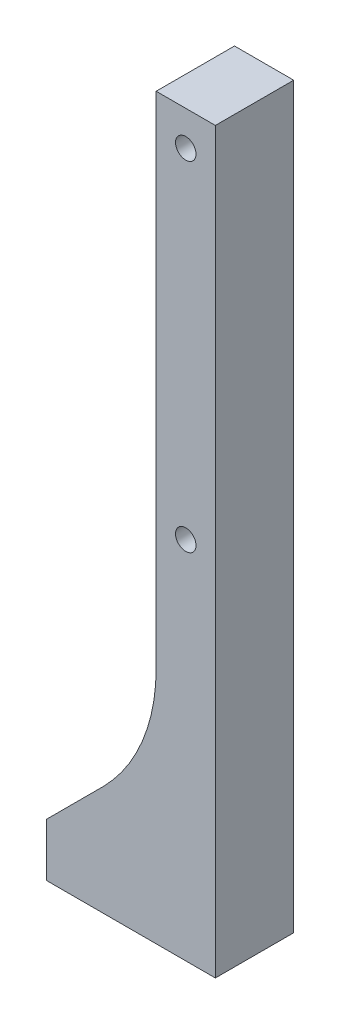
ISO-10303-21;
HEADER;
FILE_DESCRIPTION(('STEP AP214'),'2;1');
FILE_NAME('part.step','',(''),(''),'','','');
FILE_SCHEMA(('AUTOMOTIVE_DESIGN { 1 0 10303 214 1 1 1 1 }'));
ENDSEC;
DATA;
#1=APPLICATION_CONTEXT('core data for automotive mechanical design processes');
#2=APPLICATION_PROTOCOL_DEFINITION('international standard','automotive_design',2000,#1);
#3=PRODUCT_CONTEXT('',#1,'mechanical');
#4=PRODUCT('Part','Part','',(#3));
#5=PRODUCT_RELATED_PRODUCT_CATEGORY('part','',(#4));
#6=PRODUCT_DEFINITION_FORMATION('','',#4);
#7=PRODUCT_DEFINITION_CONTEXT('part definition',#1,'design');
#8=PRODUCT_DEFINITION('design','',#6,#7);
#9=PRODUCT_DEFINITION_SHAPE('','',#8);
#10=(LENGTH_UNIT() NAMED_UNIT(*) SI_UNIT(.MILLI.,.METRE.));
#11=(NAMED_UNIT(*) PLANE_ANGLE_UNIT() SI_UNIT($,.RADIAN.));
#12=(NAMED_UNIT(*) SI_UNIT($,.STERADIAN.) SOLID_ANGLE_UNIT());
#13=UNCERTAINTY_MEASURE_WITH_UNIT(LENGTH_MEASURE(1.E-05),#10,'distance_accuracy_value','');
#14=(GEOMETRIC_REPRESENTATION_CONTEXT(3) GLOBAL_UNCERTAINTY_ASSIGNED_CONTEXT((#13)) GLOBAL_UNIT_ASSIGNED_CONTEXT((#10,
#11,#12)) REPRESENTATION_CONTEXT('',''));
#15=CARTESIAN_POINT('',(0.,0.,0.));
#16=DIRECTION('',(0.,0.,1.));
#17=DIRECTION('',(1.,0.,0.));
#18=AXIS2_PLACEMENT_3D('',#15,#16,#17);
#19=CARTESIAN_POINT('',(3.25,5.8,3.25));
#20=DIRECTION('',(-1.,0.,0.));
#21=DIRECTION('',(0.,0.,1.));
#22=AXIS2_PLACEMENT_3D('',#19,#20,#21);
#23=PLANE('',#22);
#24=DIRECTION('',(0.,0.,-1.));
#25=VECTOR('',#24,1.);
#26=CARTESIAN_POINT('',(3.25,5.8,3.25));
#27=LINE('',#26,#25);
#28=CARTESIAN_POINT('',(3.25,5.8,3.5));
#29=VERTEX_POINT('',#28);
#30=CARTESIAN_POINT('',(3.25,5.8,-3.25));
#31=VERTEX_POINT('',#30);
#32=EDGE_CURVE('E195',#29,#31,#27,.T.);
#33=ORIENTED_EDGE('',*,*,#32,.F.);
#34=DIRECTION('',(0.,-1.,0.));
#35=VECTOR('',#34,1.);
#36=CARTESIAN_POINT('',(3.25,81.05,3.5));
#37=LINE('',#36,#35);
#38=CARTESIAN_POINT('',(3.25,0.,3.5));
#39=VERTEX_POINT('',#38);
#40=EDGE_CURVE('E201',#29,#39,#37,.T.);
#41=ORIENTED_EDGE('',*,*,#40,.T.);
#42=DIRECTION('',(0.,0.,-1.));
#43=VECTOR('',#42,1.);
#44=CARTESIAN_POINT('',(3.25,0.,3.25));
#45=LINE('',#44,#43);
#46=CARTESIAN_POINT('',(3.25,0.,-3.25));
#47=VERTEX_POINT('',#46);
#48=EDGE_CURVE('E249',#39,#47,#45,.T.);
#49=ORIENTED_EDGE('',*,*,#48,.T.);
#50=DIRECTION('',(0.,-1.,0.));
#51=VECTOR('',#50,1.);
#52=CARTESIAN_POINT('',(3.25,5.8,-3.25));
#53=LINE('',#52,#51);
#54=EDGE_CURVE('E252',#31,#47,#53,.T.);
#55=ORIENTED_EDGE('',*,*,#54,.F.);
#56=EDGE_LOOP('',(#33,#41,#49,#55));
#57=FACE_BOUND('',#56,.T.);
#58=ADVANCED_FACE('F37',(#57),#23,.F.);
#59=CARTESIAN_POINT('',(-11.19,26.1442712474619,-13.8054155622195));
#60=DIRECTION('',(0.,0.,1.));
#61=DIRECTION('',(1.,0.,0.));
#62=AXIS2_PLACEMENT_3D('',#59,#60,#61);
#63=CYLINDRICAL_SURFACE('',#62,20.);
#64=CARTESIAN_POINT('',(-11.19,26.1442712474619,3.5));
#65=DIRECTION('',(0.,0.,-1.));
#66=DIRECTION('',(-1.,0.,0.));
#67=AXIS2_PLACEMENT_3D('',#64,#65,#66);
#68=CIRCLE('',#67,20.);
#69=CARTESIAN_POINT('',(2.95213562373095,12.002135623731,3.5));
#70=VERTEX_POINT('',#69);
#71=CARTESIAN_POINT('',(8.81,26.1442712474619,3.5));
#72=VERTEX_POINT('',#71);
#73=EDGE_CURVE('E335',#70,#72,#68,.F.);
#74=ORIENTED_EDGE('',*,*,#73,.F.);
#75=DIRECTION('',(0.,0.,-1.));
#76=VECTOR('',#75,1.);
#77=CARTESIAN_POINT('',(2.95213562373095,12.002135623731,-13.8054155622195));
#78=LINE('',#77,#76);
#79=CARTESIAN_POINT('',(2.95213562373095,12.002135623731,12.1));
#80=VERTEX_POINT('',#79);
#81=EDGE_CURVE('E210',#80,#70,#78,.T.);
#82=ORIENTED_EDGE('',*,*,#81,.F.);
#83=CARTESIAN_POINT('',(-11.19,26.1442712474619,12.1));
#84=DIRECTION('',(0.,0.,1.));
#85=DIRECTION('',(1.,0.,0.));
#86=AXIS2_PLACEMENT_3D('',#83,#84,#85);
#87=CIRCLE('',#86,20.);
#88=CARTESIAN_POINT('',(8.81,26.1442712474619,12.1));
#89=VERTEX_POINT('',#88);
#90=EDGE_CURVE('E265',#80,#89,#87,.T.);
#91=ORIENTED_EDGE('',*,*,#90,.T.);
#92=DIRECTION('',(0.,0.,-1.));
#93=VECTOR('',#92,1.);
#94=CARTESIAN_POINT('',(8.81,26.1442712474619,-13.8054155622195));
#95=LINE('',#94,#93);
#96=EDGE_CURVE('E263',#72,#89,#95,.F.);
#97=ORIENTED_EDGE('',*,*,#96,.F.);
#98=EDGE_LOOP('',(#74,#82,#91,#97));
#99=FACE_BOUND('',#98,.T.);
#100=ADVANCED_FACE('F39',(#99),#63,.F.);
#101=CARTESIAN_POINT('',(0.,0.,0.));
#102=DIRECTION('',(0.,1.,0.));
#103=DIRECTION('',(0.,0.,1.));
#104=AXIS2_PLACEMENT_3D('',#101,#102,#103);
#105=PLANE('',#104);
#106=CARTESIAN_POINT('',(0.,0.,0.));
#107=DIRECTION('',(0.,1.,0.));
#108=DIRECTION('',(0.,0.,1.));
#109=AXIS2_PLACEMENT_3D('',#106,#107,#108);
#110=CIRCLE('',#109,1.5);
#111=CARTESIAN_POINT('',(0.,0.,1.5));
#112=VERTEX_POINT('',#111);
#113=EDGE_CURVE('E242',#112,#112,#110,.T.);
#114=ORIENTED_EDGE('',*,*,#113,.T.);
#115=EDGE_LOOP('',(#114));
#116=FACE_BOUND('',#115,.T.);
#117=DIRECTION('',(1.,0.,0.));
#118=VECTOR('',#117,1.);
#119=CARTESIAN_POINT('',(0.,0.,3.5));
#120=LINE('',#119,#118);
#121=CARTESIAN_POINT('',(15.31,0.,3.5));
#122=VERTEX_POINT('',#121);
#123=EDGE_CURVE('E202',#39,#122,#120,.T.);
#124=ORIENTED_EDGE('',*,*,#123,.T.);
#125=DIRECTION('',(0.,0.,-1.));
#126=VECTOR('',#125,1.);
#127=CARTESIAN_POINT('',(15.31,0.,0.));
#128=LINE('',#127,#126);
#129=CARTESIAN_POINT('',(15.31,0.,12.1));
#130=VERTEX_POINT('',#129);
#131=EDGE_CURVE('E236',#130,#122,#128,.T.);
#132=ORIENTED_EDGE('',*,*,#131,.F.);
#133=DIRECTION('',(1.,0.,0.));
#134=VECTOR('',#133,1.);
#135=CARTESIAN_POINT('',(3.25,0.,12.1));
#136=LINE('',#135,#134);
#137=CARTESIAN_POINT('',(-3.25,0.,12.1));
#138=VERTEX_POINT('',#137);
#139=EDGE_CURVE('E240',#138,#130,#136,.T.);
#140=ORIENTED_EDGE('',*,*,#139,.F.);
#141=DIRECTION('',(0.,0.,1.));
#142=VECTOR('',#141,1.);
#143=CARTESIAN_POINT('',(-3.25,0.,3.25));
#144=LINE('',#143,#142);
#145=CARTESIAN_POINT('',(-3.25,0.,-3.25));
#146=VERTEX_POINT('',#145);
#147=EDGE_CURVE('E255',#146,#138,#144,.T.);
#148=ORIENTED_EDGE('',*,*,#147,.F.);
#149=DIRECTION('',(-1.,0.,0.));
#150=VECTOR('',#149,1.);
#151=CARTESIAN_POINT('',(-3.25,0.,-3.25));
#152=LINE('',#151,#150);
#153=EDGE_CURVE('E246',#47,#146,#152,.T.);
#154=ORIENTED_EDGE('',*,*,#153,.F.);
#155=ORIENTED_EDGE('',*,*,#48,.F.);
#156=EDGE_LOOP('',(#124,#132,#140,#148,#154,#155));
#157=FACE_BOUND('',#156,.T.);
#158=ADVANCED_FACE('F437',(#116,#157),#105,.F.);
#159=CARTESIAN_POINT('',(15.31,0.,0.));
#160=DIRECTION('',(1.,0.,0.));
#161=DIRECTION('',(0.,0.,-1.));
#162=AXIS2_PLACEMENT_3D('',#159,#160,#161);
#163=PLANE('',#162);
#164=ORIENTED_EDGE('',*,*,#131,.T.);
#165=DIRECTION('',(0.,-1.,0.));
#166=VECTOR('',#165,1.);
#167=CARTESIAN_POINT('',(15.31,81.05,3.5));
#168=LINE('',#167,#166);
#169=CARTESIAN_POINT('',(15.31,81.05,3.5));
#170=VERTEX_POINT('',#169);
#171=EDGE_CURVE('E362',#170,#122,#168,.T.);
#172=ORIENTED_EDGE('',*,*,#171,.F.);
#173=DIRECTION('',(0.,0.,-1.));
#174=VECTOR('',#173,1.);
#175=CARTESIAN_POINT('',(15.31,81.05,0.));
#176=LINE('',#175,#174);
#177=CARTESIAN_POINT('',(15.31,81.05,12.1));
#178=VERTEX_POINT('',#177);
#179=EDGE_CURVE('E227',#178,#170,#176,.T.);
#180=ORIENTED_EDGE('',*,*,#179,.F.);
#181=DIRECTION('',(0.,-1.,0.));
#182=VECTOR('',#181,1.);
#183=CARTESIAN_POINT('',(15.31,0.,12.1));
#184=LINE('',#183,#182);
#185=EDGE_CURVE('E233',#178,#130,#184,.T.);
#186=ORIENTED_EDGE('',*,*,#185,.T.);
#187=EDGE_LOOP('',(#164,#172,#180,#186));
#188=FACE_BOUND('',#187,.T.);
#189=ADVANCED_FACE('F474',(#188),#163,.T.);
#190=CARTESIAN_POINT('',(8.81,81.05,0.));
#191=DIRECTION('',(-1.,0.,0.));
#192=DIRECTION('',(0.,0.,1.));
#193=AXIS2_PLACEMENT_3D('',#190,#191,#192);
#194=PLANE('',#193);
#195=DIRECTION('',(0.,0.,-1.));
#196=VECTOR('',#195,1.);
#197=CARTESIAN_POINT('',(8.81,81.05,0.));
#198=LINE('',#197,#196);
#199=CARTESIAN_POINT('',(8.81,81.05,12.1));
#200=VERTEX_POINT('',#199);
#201=CARTESIAN_POINT('',(8.81,81.05,3.5));
#202=VERTEX_POINT('',#201);
#203=EDGE_CURVE('E215',#200,#202,#198,.T.);
#204=ORIENTED_EDGE('',*,*,#203,.T.);
#205=DIRECTION('',(0.,-1.,0.));
#206=VECTOR('',#205,1.);
#207=CARTESIAN_POINT('',(8.81,81.05,3.5));
#208=LINE('',#207,#206);
#209=EDGE_CURVE('E52',#202,#72,#208,.T.);
#210=ORIENTED_EDGE('',*,*,#209,.T.);
#211=ORIENTED_EDGE('',*,*,#96,.T.);
#212=DIRECTION('',(0.,-1.,0.));
#213=VECTOR('',#212,1.);
#214=CARTESIAN_POINT('',(8.81,81.05,12.1));
#215=LINE('',#214,#213);
#216=EDGE_CURVE('E230',#200,#89,#215,.T.);
#217=ORIENTED_EDGE('',*,*,#216,.F.);
#218=EDGE_LOOP('',(#204,#210,#211,#217));
#219=FACE_BOUND('',#218,.T.);
#220=ADVANCED_FACE('F464',(#219),#194,.T.);
#221=CARTESIAN_POINT('',(0.,81.05,0.));
#222=DIRECTION('',(0.,1.,0.));
#223=DIRECTION('',(0.,0.,1.));
#224=AXIS2_PLACEMENT_3D('',#221,#222,#223);
#225=PLANE('',#224);
#226=ORIENTED_EDGE('',*,*,#179,.T.);
#227=DIRECTION('',(1.,0.,0.));
#228=VECTOR('',#227,1.);
#229=CARTESIAN_POINT('',(0.,81.05,3.5));
#230=LINE('',#229,#228);
#231=EDGE_CURVE('E469',#202,#170,#230,.T.);
#232=ORIENTED_EDGE('',*,*,#231,.F.);
#233=ORIENTED_EDGE('',*,*,#203,.F.);
#234=DIRECTION('',(1.,0.,0.));
#235=VECTOR('',#234,1.);
#236=CARTESIAN_POINT('',(0.,81.05,12.1));
#237=LINE('',#236,#235);
#238=EDGE_CURVE('E219',#200,#178,#237,.T.);
#239=ORIENTED_EDGE('',*,*,#238,.T.);
#240=EDGE_LOOP('',(#226,#232,#233,#239));
#241=FACE_BOUND('',#240,.T.);
#242=ADVANCED_FACE('F467',(#241),#225,.T.);
#243=CARTESIAN_POINT('',(10.1114428414844,0.,5.25));
#244=DIRECTION('',(-1.,0.,0.));
#245=DIRECTION('',(0.,-1.,0.));
#246=AXIS2_PLACEMENT_3D('',#243,#244,#245);
#247=PLANE('',#246);
#248=DIRECTION('',(0.,-1.,0.));
#249=VECTOR('',#248,1.);
#250=CARTESIAN_POINT('',(10.1114428414844,0.,3.5));
#251=LINE('',#250,#249);
#252=CARTESIAN_POINT('',(10.111442841485,78.3750000000001,3.5));
#253=VERTEX_POINT('',#252);
#254=CARTESIAN_POINT('',(10.111442841485,76.125,3.5));
#255=VERTEX_POINT('',#254);
#256=EDGE_CURVE('E379',#253,#255,#251,.T.);
#257=ORIENTED_EDGE('',*,*,#256,.F.);
#258=DIRECTION('',(0.,0.,-1.));
#259=VECTOR('',#258,1.);
#260=CARTESIAN_POINT('',(10.111442841485,78.3750000000001,5.25));
#261=LINE('',#260,#259);
#262=CARTESIAN_POINT('',(10.111442841485,78.3750000000001,5.25));
#263=VERTEX_POINT('',#262);
#264=EDGE_CURVE('E328',#263,#253,#261,.T.);
#265=ORIENTED_EDGE('',*,*,#264,.F.);
#266=DIRECTION('',(0.,1.,0.));
#267=VECTOR('',#266,1.);
#268=CARTESIAN_POINT('',(10.1114428414844,0.,5.25));
#269=LINE('',#268,#267);
#270=CARTESIAN_POINT('',(10.111442841485,76.125,5.25));
#271=VERTEX_POINT('',#270);
#272=EDGE_CURVE('E385',#271,#263,#269,.T.);
#273=ORIENTED_EDGE('',*,*,#272,.F.);
#274=DIRECTION('',(0.,0.,-1.));
#275=VECTOR('',#274,1.);
#276=CARTESIAN_POINT('',(10.111442841485,76.125,5.25));
#277=LINE('',#276,#275);
#278=EDGE_CURVE('E304',#271,#255,#277,.T.);
#279=ORIENTED_EDGE('',*,*,#278,.T.);
#280=EDGE_LOOP('',(#257,#265,#273,#279));
#281=FACE_BOUND('',#280,.T.);
#282=ADVANCED_FACE('F406',(#281),#247,.F.);
#283=CARTESIAN_POINT('',(35.4909526419169,61.4721331848196,5.24999999999999));
#284=DIRECTION('',(-0.500000000000008,-0.866025403784434,0.));
#285=DIRECTION('',(0.866025403784434,-0.500000000000009,0.));
#286=AXIS2_PLACEMENT_3D('',#283,#284,#285);
#287=PLANE('',#286);
#288=DIRECTION('',(0.866025403784434,-0.500000000000009,0.));
#289=VECTOR('',#288,1.);
#290=CARTESIAN_POINT('',(35.4909526419169,61.4721331848196,3.5));
#291=LINE('',#290,#289);
#292=CARTESIAN_POINT('',(12.06,75.,3.5));
#293=VERTEX_POINT('',#292);
#294=EDGE_CURVE('E377',#255,#293,#291,.T.);
#295=ORIENTED_EDGE('',*,*,#294,.F.);
#296=ORIENTED_EDGE('',*,*,#278,.F.);
#297=DIRECTION('',(-0.866025403784434,0.500000000000009,0.));
#298=VECTOR('',#297,1.);
#299=CARTESIAN_POINT('',(35.4909526419169,61.4721331848196,5.24999999999999));
#300=LINE('',#299,#298);
#301=CARTESIAN_POINT('',(12.06,75.,5.25));
#302=VERTEX_POINT('',#301);
#303=EDGE_CURVE('E317',#302,#271,#300,.T.);
#304=ORIENTED_EDGE('',*,*,#303,.F.);
#305=DIRECTION('',(0.,0.,-1.));
#306=VECTOR('',#305,1.);
#307=CARTESIAN_POINT('',(12.06,75.,5.25));
#308=LINE('',#307,#306);
#309=EDGE_CURVE('E308',#302,#293,#308,.T.);
#310=ORIENTED_EDGE('',*,*,#309,.T.);
#311=EDGE_LOOP('',(#295,#296,#304,#310));
#312=FACE_BOUND('',#311,.T.);
#313=ADVANCED_FACE('F405',(#312),#287,.F.);
#314=CARTESIAN_POINT('',(-29.4609526419161,51.0278668151807,5.25));
#315=DIRECTION('',(0.499999999999989,-0.866025403784445,0.));
#316=DIRECTION('',(0.866025403784445,0.499999999999989,0.));
#317=AXIS2_PLACEMENT_3D('',#314,#315,#316);
#318=PLANE('',#317);
#319=DIRECTION('',(0.866025403784445,0.499999999999989,0.));
#320=VECTOR('',#319,1.);
#321=CARTESIAN_POINT('',(-29.4609526419161,51.0278668151807,3.5));
#322=LINE('',#321,#320);
#323=CARTESIAN_POINT('',(14.008557158515,76.125,3.5));
#324=VERTEX_POINT('',#323);
#325=EDGE_CURVE('E375',#293,#324,#322,.T.);
#326=ORIENTED_EDGE('',*,*,#325,.F.);
#327=ORIENTED_EDGE('',*,*,#309,.F.);
#328=DIRECTION('',(-0.866025403784445,-0.499999999999989,0.));
#329=VECTOR('',#328,1.);
#330=CARTESIAN_POINT('',(-29.4609526419161,51.0278668151807,5.25));
#331=LINE('',#330,#329);
#332=CARTESIAN_POINT('',(14.008557158515,76.125,5.25));
#333=VERTEX_POINT('',#332);
#334=EDGE_CURVE('E396',#333,#302,#331,.T.);
#335=ORIENTED_EDGE('',*,*,#334,.F.);
#336=DIRECTION('',(0.,0.,-1.));
#337=VECTOR('',#336,1.);
#338=CARTESIAN_POINT('',(14.008557158515,76.125,5.25));
#339=LINE('',#338,#337);
#340=EDGE_CURVE('E314',#333,#324,#339,.T.);
#341=ORIENTED_EDGE('',*,*,#340,.T.);
#342=EDGE_LOOP('',(#326,#327,#335,#341));
#343=FACE_BOUND('',#342,.T.);
#344=ADVANCED_FACE('F419',(#343),#318,.F.);
#345=CARTESIAN_POINT('',(14.0085571585143,-1.18804756729695E-13,5.25));
#346=DIRECTION('',(1.,0.,0.));
#347=DIRECTION('',(0.,1.,0.));
#348=AXIS2_PLACEMENT_3D('',#345,#346,#347);
#349=PLANE('',#348);
#350=DIRECTION('',(0.,1.,0.));
#351=VECTOR('',#350,1.);
#352=CARTESIAN_POINT('',(14.0085571585143,-1.18804756729695E-13,3.5));
#353=LINE('',#352,#351);
#354=CARTESIAN_POINT('',(14.008557158515,78.375,3.5));
#355=VERTEX_POINT('',#354);
#356=EDGE_CURVE('E373',#324,#355,#353,.T.);
#357=ORIENTED_EDGE('',*,*,#356,.F.);
#358=ORIENTED_EDGE('',*,*,#340,.F.);
#359=DIRECTION('',(0.,-1.,0.));
#360=VECTOR('',#359,1.);
#361=CARTESIAN_POINT('',(14.0085571585143,-1.18804756729695E-13,5.25));
#362=LINE('',#361,#360);
#363=CARTESIAN_POINT('',(14.008557158515,78.375,5.25));
#364=VERTEX_POINT('',#363);
#365=EDGE_CURVE('E394',#364,#333,#362,.T.);
#366=ORIENTED_EDGE('',*,*,#365,.F.);
#367=DIRECTION('',(0.,0.,-1.));
#368=VECTOR('',#367,1.);
#369=CARTESIAN_POINT('',(14.008557158515,78.375,5.25));
#370=LINE('',#369,#368);
#371=EDGE_CURVE('E322',#364,#355,#370,.T.);
#372=ORIENTED_EDGE('',*,*,#371,.T.);
#373=EDGE_LOOP('',(#357,#358,#366,#372));
#374=FACE_BOUND('',#373,.T.);
#375=ADVANCED_FACE('F416',(#374),#349,.F.);
#376=CARTESIAN_POINT('',(37.4395098004321,64.8471331848194,5.24999999999999));
#377=DIRECTION('',(0.500000000000011,0.866025403784432,0.));
#378=DIRECTION('',(-0.866025403784432,0.500000000000011,0.));
#379=AXIS2_PLACEMENT_3D('',#376,#377,#378);
#380=PLANE('',#379);
#381=DIRECTION('',(-0.866025403784432,0.500000000000011,0.));
#382=VECTOR('',#381,1.);
#383=CARTESIAN_POINT('',(37.4395098004321,64.8471331848194,3.5));
#384=LINE('',#383,#382);
#385=CARTESIAN_POINT('',(12.06,79.5,3.5));
#386=VERTEX_POINT('',#385);
#387=EDGE_CURVE('E60',#355,#386,#384,.T.);
#388=ORIENTED_EDGE('',*,*,#387,.F.);
#389=ORIENTED_EDGE('',*,*,#371,.F.);
#390=DIRECTION('',(0.866025403784432,-0.500000000000011,0.));
#391=VECTOR('',#390,1.);
#392=CARTESIAN_POINT('',(37.4395098004321,64.8471331848194,5.24999999999999));
#393=LINE('',#392,#391);
#394=CARTESIAN_POINT('',(12.06,79.5,5.25));
#395=VERTEX_POINT('',#394);
#396=EDGE_CURVE('E391',#395,#364,#393,.T.);
#397=ORIENTED_EDGE('',*,*,#396,.F.);
#398=DIRECTION('',(0.,0.,-1.));
#399=VECTOR('',#398,1.);
#400=CARTESIAN_POINT('',(12.06,79.5,5.25));
#401=LINE('',#400,#399);
#402=EDGE_CURVE('E325',#395,#386,#401,.T.);
#403=ORIENTED_EDGE('',*,*,#402,.T.);
#404=EDGE_LOOP('',(#388,#389,#397,#403));
#405=FACE_BOUND('',#404,.T.);
#406=ADVANCED_FACE('F413',(#405),#380,.F.);
#407=CARTESIAN_POINT('',(-31.4095098004312,54.4028668151806,5.25000000000001));
#408=DIRECTION('',(-0.499999999999991,0.866025403784444,0.));
#409=DIRECTION('',(-0.866025403784444,-0.499999999999991,0.));
#410=AXIS2_PLACEMENT_3D('',#407,#408,#409);
#411=PLANE('',#410);
#412=DIRECTION('',(-0.866025403784444,-0.499999999999991,0.));
#413=VECTOR('',#412,1.);
#414=CARTESIAN_POINT('',(-31.4095098004312,54.4028668151806,3.5));
#415=LINE('',#414,#413);
#416=EDGE_CURVE('E284',#386,#253,#415,.T.);
#417=ORIENTED_EDGE('',*,*,#416,.F.);
#418=ORIENTED_EDGE('',*,*,#402,.F.);
#419=DIRECTION('',(0.866025403784444,0.499999999999991,0.));
#420=VECTOR('',#419,1.);
#421=CARTESIAN_POINT('',(-31.4095098004312,54.4028668151806,5.25000000000001));
#422=LINE('',#421,#420);
#423=EDGE_CURVE('E388',#263,#395,#422,.T.);
#424=ORIENTED_EDGE('',*,*,#423,.F.);
#425=ORIENTED_EDGE('',*,*,#264,.T.);
#426=EDGE_LOOP('',(#417,#418,#424,#425));
#427=FACE_BOUND('',#426,.T.);
#428=ADVANCED_FACE('F409',(#427),#411,.F.);
#429=CARTESIAN_POINT('',(10.1114428414846,-1.09141245254975E-13,5.25));
#430=DIRECTION('',(-1.,0.,0.));
#431=DIRECTION('',(0.,-1.,0.));
#432=AXIS2_PLACEMENT_3D('',#429,#430,#431);
#433=PLANE('',#432);
#434=DIRECTION('',(0.,-1.,0.));
#435=VECTOR('',#434,1.);
#436=CARTESIAN_POINT('',(10.1114428414846,-1.09141245254975E-13,3.5));
#437=LINE('',#436,#435);
#438=CARTESIAN_POINT('',(10.111442841485,41.175,3.5));
#439=VERTEX_POINT('',#438);
#440=CARTESIAN_POINT('',(10.111442841485,38.925,3.5));
#441=VERTEX_POINT('',#440);
#442=EDGE_CURVE('E270',#439,#441,#437,.T.);
#443=ORIENTED_EDGE('',*,*,#442,.F.);
#444=DIRECTION('',(0.,0.,-1.));
#445=VECTOR('',#444,1.);
#446=CARTESIAN_POINT('',(10.111442841485,41.175,5.25));
#447=LINE('',#446,#445);
#448=CARTESIAN_POINT('',(10.111442841485,41.175,5.25));
#449=VERTEX_POINT('',#448);
#450=EDGE_CURVE('E281',#449,#439,#447,.T.);
#451=ORIENTED_EDGE('',*,*,#450,.F.);
#452=DIRECTION('',(0.,1.,0.));
#453=VECTOR('',#452,1.);
#454=CARTESIAN_POINT('',(10.1114428414846,-1.09141245254975E-13,5.25));
#455=LINE('',#454,#453);
#456=CARTESIAN_POINT('',(10.111442841485,38.925,5.25));
#457=VERTEX_POINT('',#456);
#458=EDGE_CURVE('E334',#457,#449,#455,.T.);
#459=ORIENTED_EDGE('',*,*,#458,.F.);
#460=DIRECTION('',(0.,0.,-1.));
#461=VECTOR('',#460,1.);
#462=CARTESIAN_POINT('',(10.111442841485,38.925,5.25));
#463=LINE('',#462,#461);
#464=EDGE_CURVE('E283',#457,#441,#463,.T.);
#465=ORIENTED_EDGE('',*,*,#464,.T.);
#466=EDGE_LOOP('',(#443,#451,#459,#465));
#467=FACE_BOUND('',#466,.T.);
#468=ADVANCED_FACE('F279',(#467),#433,.F.);
#469=CARTESIAN_POINT('',(19.3828801315262,33.5721331848199,5.25));
#470=DIRECTION('',(-0.500000000000008,-0.866025403784434,0.));
#471=DIRECTION('',(0.866025403784434,-0.500000000000008,0.));
#472=AXIS2_PLACEMENT_3D('',#469,#470,#471);
#473=PLANE('',#472);
#474=DIRECTION('',(0.866025403784434,-0.500000000000008,0.));
#475=VECTOR('',#474,1.);
#476=CARTESIAN_POINT('',(19.3828801315262,33.5721331848199,3.5));
#477=LINE('',#476,#475);
#478=CARTESIAN_POINT('',(12.06,37.8,3.5));
#479=VERTEX_POINT('',#478);
#480=EDGE_CURVE('E285',#441,#479,#477,.T.);
#481=ORIENTED_EDGE('',*,*,#480,.F.);
#482=ORIENTED_EDGE('',*,*,#464,.F.);
#483=DIRECTION('',(-0.866025403784434,0.500000000000008,0.));
#484=VECTOR('',#483,1.);
#485=CARTESIAN_POINT('',(19.3828801315262,33.5721331848199,5.25));
#486=LINE('',#485,#484);
#487=CARTESIAN_POINT('',(12.06,37.8,5.25));
#488=VERTEX_POINT('',#487);
#489=EDGE_CURVE('E292',#488,#457,#486,.T.);
#490=ORIENTED_EDGE('',*,*,#489,.F.);
#491=DIRECTION('',(0.,0.,-1.));
#492=VECTOR('',#491,1.);
#493=CARTESIAN_POINT('',(12.06,37.8,5.25));
#494=LINE('',#493,#492);
#495=EDGE_CURVE('E348',#488,#479,#494,.T.);
#496=ORIENTED_EDGE('',*,*,#495,.T.);
#497=EDGE_LOOP('',(#481,#482,#490,#496));
#498=FACE_BOUND('',#497,.T.);
#499=ADVANCED_FACE('F626',(#498),#473,.F.);
#500=CARTESIAN_POINT('',(-13.3528801315259,23.12786681518,5.25));
#501=DIRECTION('',(0.499999999999996,-0.866025403784441,0.));
#502=DIRECTION('',(0.866025403784441,0.499999999999996,0.));
#503=AXIS2_PLACEMENT_3D('',#500,#501,#502);
#504=PLANE('',#503);
#505=DIRECTION('',(0.866025403784441,0.499999999999996,0.));
#506=VECTOR('',#505,1.);
#507=CARTESIAN_POINT('',(-13.3528801315259,23.12786681518,3.5));
#508=LINE('',#507,#506);
#509=CARTESIAN_POINT('',(14.008557158515,38.925,3.5));
#510=VERTEX_POINT('',#509);
#511=EDGE_CURVE('E364',#479,#510,#508,.T.);
#512=ORIENTED_EDGE('',*,*,#511,.F.);
#513=ORIENTED_EDGE('',*,*,#495,.F.);
#514=DIRECTION('',(-0.866025403784441,-0.499999999999996,0.));
#515=VECTOR('',#514,1.);
#516=CARTESIAN_POINT('',(-13.3528801315259,23.12786681518,5.25));
#517=LINE('',#516,#515);
#518=CARTESIAN_POINT('',(14.008557158515,38.925,5.25));
#519=VERTEX_POINT('',#518);
#520=EDGE_CURVE('E297',#519,#488,#517,.T.);
#521=ORIENTED_EDGE('',*,*,#520,.F.);
#522=DIRECTION('',(0.,0.,-1.));
#523=VECTOR('',#522,1.);
#524=CARTESIAN_POINT('',(14.008557158515,38.925,5.25));
#525=LINE('',#524,#523);
#526=EDGE_CURVE('E351',#519,#510,#525,.T.);
#527=ORIENTED_EDGE('',*,*,#526,.T.);
#528=EDGE_LOOP('',(#512,#513,#521,#527));
#529=FACE_BOUND('',#528,.T.);
#530=ADVANCED_FACE('F635',(#529),#504,.F.);
#531=CARTESIAN_POINT('',(14.0085571585148,0.,5.25));
#532=DIRECTION('',(1.,0.,0.));
#533=DIRECTION('',(0.,1.,0.));
#534=AXIS2_PLACEMENT_3D('',#531,#532,#533);
#535=PLANE('',#534);
#536=DIRECTION('',(0.,1.,0.));
#537=VECTOR('',#536,1.);
#538=CARTESIAN_POINT('',(14.0085571585148,0.,3.5));
#539=LINE('',#538,#537);
#540=CARTESIAN_POINT('',(14.008557158515,41.175,3.5));
#541=VERTEX_POINT('',#540);
#542=EDGE_CURVE('E358',#510,#541,#539,.T.);
#543=ORIENTED_EDGE('',*,*,#542,.F.);
#544=ORIENTED_EDGE('',*,*,#526,.F.);
#545=DIRECTION('',(0.,-1.,0.));
#546=VECTOR('',#545,1.);
#547=CARTESIAN_POINT('',(14.0085571585148,0.,5.25));
#548=LINE('',#547,#546);
#549=CARTESIAN_POINT('',(14.008557158515,41.175,5.25));
#550=VERTEX_POINT('',#549);
#551=EDGE_CURVE('E341',#550,#519,#548,.T.);
#552=ORIENTED_EDGE('',*,*,#551,.F.);
#553=DIRECTION('',(0.,0.,-1.));
#554=VECTOR('',#553,1.);
#555=CARTESIAN_POINT('',(14.008557158515,41.175,5.25));
#556=LINE('',#555,#554);
#557=EDGE_CURVE('E294',#550,#541,#556,.T.);
#558=ORIENTED_EDGE('',*,*,#557,.T.);
#559=EDGE_LOOP('',(#543,#544,#552,#558));
#560=FACE_BOUND('',#559,.T.);
#561=ADVANCED_FACE('F357',(#560),#535,.F.);
#562=CARTESIAN_POINT('',(21.3314372900409,36.9471331848201,5.25));
#563=DIRECTION('',(0.500000000000002,0.866025403784438,0.));
#564=DIRECTION('',(-0.866025403784438,0.500000000000002,0.));
#565=AXIS2_PLACEMENT_3D('',#562,#563,#564);
#566=PLANE('',#565);
#567=DIRECTION('',(-0.866025403784438,0.500000000000002,0.));
#568=VECTOR('',#567,1.);
#569=CARTESIAN_POINT('',(21.3314372900409,36.9471331848201,3.5));
#570=LINE('',#569,#568);
#571=CARTESIAN_POINT('',(12.06,42.3,3.5));
#572=VERTEX_POINT('',#571);
#573=EDGE_CURVE('E273',#541,#572,#570,.T.);
#574=ORIENTED_EDGE('',*,*,#573,.F.);
#575=ORIENTED_EDGE('',*,*,#557,.F.);
#576=DIRECTION('',(0.866025403784438,-0.500000000000002,0.));
#577=VECTOR('',#576,1.);
#578=CARTESIAN_POINT('',(21.3314372900409,36.9471331848201,5.25));
#579=LINE('',#578,#577);
#580=CARTESIAN_POINT('',(12.06,42.3,5.25));
#581=VERTEX_POINT('',#580);
#582=EDGE_CURVE('E338',#581,#550,#579,.T.);
#583=ORIENTED_EDGE('',*,*,#582,.F.);
#584=DIRECTION('',(0.,0.,-1.));
#585=VECTOR('',#584,1.);
#586=CARTESIAN_POINT('',(12.06,42.3,5.25));
#587=LINE('',#586,#585);
#588=EDGE_CURVE('E291',#581,#572,#587,.T.);
#589=ORIENTED_EDGE('',*,*,#588,.T.);
#590=EDGE_LOOP('',(#574,#575,#583,#589));
#591=FACE_BOUND('',#590,.T.);
#592=ADVANCED_FACE('F361',(#591),#566,.F.);
#593=CARTESIAN_POINT('',(-15.3014372900408,26.50286681518,5.25));
#594=DIRECTION('',(-0.499999999999996,0.866025403784441,0.));
#595=DIRECTION('',(-0.866025403784441,-0.499999999999996,0.));
#596=AXIS2_PLACEMENT_3D('',#593,#594,#595);
#597=PLANE('',#596);
#598=DIRECTION('',(-0.866025403784441,-0.499999999999996,0.));
#599=VECTOR('',#598,1.);
#600=CARTESIAN_POINT('',(-15.3014372900408,26.50286681518,3.5));
#601=LINE('',#600,#599);
#602=EDGE_CURVE('E45',#572,#439,#601,.T.);
#603=ORIENTED_EDGE('',*,*,#602,.F.);
#604=ORIENTED_EDGE('',*,*,#588,.F.);
#605=DIRECTION('',(0.866025403784441,0.499999999999996,0.));
#606=VECTOR('',#605,1.);
#607=CARTESIAN_POINT('',(-15.3014372900408,26.50286681518,5.25));
#608=LINE('',#607,#606);
#609=EDGE_CURVE('E289',#449,#581,#608,.T.);
#610=ORIENTED_EDGE('',*,*,#609,.F.);
#611=ORIENTED_EDGE('',*,*,#450,.T.);
#612=EDGE_LOOP('',(#603,#604,#610,#611));
#613=FACE_BOUND('',#612,.T.);
#614=ADVANCED_FACE('F287',(#613),#597,.F.);
#615=CARTESIAN_POINT('',(12.06,40.05,-3.25));
#616=DIRECTION('',(0.,0.,1.));
#617=DIRECTION('',(1.,0.,0.));
#618=AXIS2_PLACEMENT_3D('',#615,#616,#617);
#619=CYLINDRICAL_SURFACE('',#618,1.125);
#620=CARTESIAN_POINT('',(12.06,40.05,12.1));
#621=DIRECTION('',(0.,0.,1.));
#622=DIRECTION('',(1.,0.,0.));
#623=AXIS2_PLACEMENT_3D('',#620,#621,#622);
#624=CIRCLE('',#623,1.125);
#625=CARTESIAN_POINT('',(13.185,40.05,12.1));
#626=VERTEX_POINT('',#625);
#627=EDGE_CURVE('E302',#626,#626,#624,.T.);
#628=ORIENTED_EDGE('',*,*,#627,.T.);
#629=EDGE_LOOP('',(#628));
#630=FACE_BOUND('',#629,.T.);
#631=CARTESIAN_POINT('',(12.06,40.05,5.25));
#632=DIRECTION('',(0.,0.,-1.));
#633=DIRECTION('',(-1.,0.,0.));
#634=AXIS2_PLACEMENT_3D('',#631,#632,#633);
#635=CIRCLE('',#634,1.125);
#636=CARTESIAN_POINT('',(10.935,40.05,5.25));
#637=VERTEX_POINT('',#636);
#638=EDGE_CURVE('E331',#637,#637,#635,.F.);
#639=ORIENTED_EDGE('',*,*,#638,.F.);
#640=EDGE_LOOP('',(#639));
#641=FACE_BOUND('',#640,.T.);
#642=ADVANCED_FACE('F668',(#630,#641),#619,.F.);
#643=CARTESIAN_POINT('',(12.06,77.25,-3.25));
#644=DIRECTION('',(0.,0.,1.));
#645=DIRECTION('',(1.,0.,0.));
#646=AXIS2_PLACEMENT_3D('',#643,#644,#645);
#647=CYLINDRICAL_SURFACE('',#646,1.125);
#648=CARTESIAN_POINT('',(12.06,77.25,12.1));
#649=DIRECTION('',(0.,0.,1.));
#650=DIRECTION('',(1.,0.,0.));
#651=AXIS2_PLACEMENT_3D('',#648,#649,#650);
#652=CIRCLE('',#651,1.125);
#653=CARTESIAN_POINT('',(13.185,77.25,12.1));
#654=VERTEX_POINT('',#653);
#655=EDGE_CURVE('E221',#654,#654,#652,.T.);
#656=ORIENTED_EDGE('',*,*,#655,.T.);
#657=EDGE_LOOP('',(#656));
#658=FACE_BOUND('',#657,.T.);
#659=CARTESIAN_POINT('',(12.06,77.25,5.25));
#660=DIRECTION('',(0.,0.,-1.));
#661=DIRECTION('',(-1.,0.,0.));
#662=AXIS2_PLACEMENT_3D('',#659,#660,#661);
#663=CIRCLE('',#662,1.125);
#664=CARTESIAN_POINT('',(10.935,77.25,5.25));
#665=VERTEX_POINT('',#664);
#666=EDGE_CURVE('E347',#665,#665,#663,.F.);
#667=ORIENTED_EDGE('',*,*,#666,.F.);
#668=EDGE_LOOP('',(#667));
#669=FACE_BOUND('',#668,.T.);
#670=ADVANCED_FACE('F451',(#658,#669),#647,.F.);
#671=CARTESIAN_POINT('',(0.,5.8,0.));
#672=DIRECTION('',(0.,1.,0.));
#673=DIRECTION('',(0.,0.,1.));
#674=AXIS2_PLACEMENT_3D('',#671,#672,#673);
#675=PLANE('',#674);
#676=DIRECTION('',(0.,0.,1.));
#677=VECTOR('',#676,1.);
#678=CARTESIAN_POINT('',(-3.25,5.8,3.25));
#679=LINE('',#678,#677);
#680=CARTESIAN_POINT('',(-3.25,5.8,-3.25));
#681=VERTEX_POINT('',#680);
#682=CARTESIAN_POINT('',(-3.25,5.8,3.5));
#683=VERTEX_POINT('',#682);
#684=EDGE_CURVE('E183',#681,#683,#679,.T.);
#685=ORIENTED_EDGE('',*,*,#684,.T.);
#686=DIRECTION('',(-1.,0.,0.));
#687=VECTOR('',#686,1.);
#688=CARTESIAN_POINT('',(0.,5.8,3.5));
#689=LINE('',#688,#687);
#690=EDGE_CURVE('E187',#29,#683,#689,.T.);
#691=ORIENTED_EDGE('',*,*,#690,.F.);
#692=ORIENTED_EDGE('',*,*,#32,.T.);
#693=DIRECTION('',(-1.,0.,0.));
#694=VECTOR('',#693,1.);
#695=CARTESIAN_POINT('',(-3.25,5.8,-3.25));
#696=LINE('',#695,#694);
#697=EDGE_CURVE('E190',#31,#681,#696,.T.);
#698=ORIENTED_EDGE('',*,*,#697,.T.);
#699=EDGE_LOOP('',(#685,#691,#692,#698));
#700=FACE_BOUND('',#699,.T.);
#701=CARTESIAN_POINT('',(0.,5.8,0.));
#702=DIRECTION('',(0.,1.,0.));
#703=DIRECTION('',(0.,0.,1.));
#704=AXIS2_PLACEMENT_3D('',#701,#702,#703);
#705=CIRCLE('',#704,1.5);
#706=CARTESIAN_POINT('',(0.,5.8,1.5));
#707=VERTEX_POINT('',#706);
#708=EDGE_CURVE('E243',#707,#707,#705,.T.);
#709=ORIENTED_EDGE('',*,*,#708,.F.);
#710=EDGE_LOOP('',(#709));
#711=FACE_BOUND('',#710,.T.);
#712=ADVANCED_FACE('F185',(#700,#711),#675,.T.);
#713=CARTESIAN_POINT('',(-3.25,5.8,-3.25));
#714=DIRECTION('',(0.,0.,1.));
#715=DIRECTION('',(1.,0.,0.));
#716=AXIS2_PLACEMENT_3D('',#713,#714,#715);
#717=PLANE('',#716);
#718=ORIENTED_EDGE('',*,*,#153,.T.);
#719=DIRECTION('',(0.,-1.,0.));
#720=VECTOR('',#719,1.);
#721=CARTESIAN_POINT('',(-3.25,5.8,-3.25));
#722=LINE('',#721,#720);
#723=EDGE_CURVE('E260',#681,#146,#722,.T.);
#724=ORIENTED_EDGE('',*,*,#723,.F.);
#725=ORIENTED_EDGE('',*,*,#697,.F.);
#726=ORIENTED_EDGE('',*,*,#54,.T.);
#727=EDGE_LOOP('',(#718,#724,#725,#726));
#728=FACE_BOUND('',#727,.T.);
#729=ADVANCED_FACE('F444',(#728),#717,.F.);
#730=CARTESIAN_POINT('',(-3.25,5.8,3.25));
#731=DIRECTION('',(1.,0.,0.));
#732=DIRECTION('',(0.,0.,-1.));
#733=AXIS2_PLACEMENT_3D('',#730,#731,#732);
#734=PLANE('',#733);
#735=ORIENTED_EDGE('',*,*,#147,.T.);
#736=DIRECTION('',(0.,-1.,0.));
#737=VECTOR('',#736,1.);
#738=CARTESIAN_POINT('',(-3.25,0.,12.1));
#739=LINE('',#738,#737);
#740=CARTESIAN_POINT('',(-3.25,5.8,12.1));
#741=VERTEX_POINT('',#740);
#742=EDGE_CURVE('E214',#741,#138,#739,.T.);
#743=ORIENTED_EDGE('',*,*,#742,.F.);
#744=DIRECTION('',(0.,0.,1.));
#745=VECTOR('',#744,1.);
#746=CARTESIAN_POINT('',(-3.25,5.8,-13.8054155622195));
#747=LINE('',#746,#745);
#748=EDGE_CURVE('E207',#683,#741,#747,.T.);
#749=ORIENTED_EDGE('',*,*,#748,.F.);
#750=ORIENTED_EDGE('',*,*,#684,.F.);
#751=ORIENTED_EDGE('',*,*,#723,.T.);
#752=EDGE_LOOP('',(#735,#743,#749,#750,#751));
#753=FACE_BOUND('',#752,.T.);
#754=ADVANCED_FACE('F212',(#753),#734,.F.);
#755=CARTESIAN_POINT('',(0.,5.8,0.));
#756=DIRECTION('',(0.,-1.,0.));
#757=DIRECTION('',(0.,0.,-1.));
#758=AXIS2_PLACEMENT_3D('',#755,#756,#757);
#759=CYLINDRICAL_SURFACE('',#758,1.5);
#760=ORIENTED_EDGE('',*,*,#708,.T.);
#761=EDGE_LOOP('',(#760));
#762=FACE_BOUND('',#761,.T.);
#763=ORIENTED_EDGE('',*,*,#113,.F.);
#764=EDGE_LOOP('',(#763));
#765=FACE_BOUND('',#764,.T.);
#766=ADVANCED_FACE('F443',(#762,#765),#759,.F.);
#767=CARTESIAN_POINT('',(0.,0.,12.1));
#768=DIRECTION('',(0.,0.,1.));
#769=DIRECTION('',(1.,0.,0.));
#770=AXIS2_PLACEMENT_3D('',#767,#768,#769);
#771=PLANE('',#770);
#772=ORIENTED_EDGE('',*,*,#655,.F.);
#773=EDGE_LOOP('',(#772));
#774=FACE_BOUND('',#773,.T.);
#775=ORIENTED_EDGE('',*,*,#627,.F.);
#776=EDGE_LOOP('',(#775));
#777=FACE_BOUND('',#776,.T.);
#778=ORIENTED_EDGE('',*,*,#90,.F.);
#779=DIRECTION('',(-0.707106781186548,-0.707106781186548,0.));
#780=VECTOR('',#779,1.);
#781=CARTESIAN_POINT('',(-3.25,5.8,12.1));
#782=LINE('',#781,#780);
#783=EDGE_CURVE('E216',#80,#741,#782,.T.);
#784=ORIENTED_EDGE('',*,*,#783,.T.);
#785=ORIENTED_EDGE('',*,*,#742,.T.);
#786=ORIENTED_EDGE('',*,*,#139,.T.);
#787=ORIENTED_EDGE('',*,*,#185,.F.);
#788=ORIENTED_EDGE('',*,*,#238,.F.);
#789=ORIENTED_EDGE('',*,*,#216,.T.);
#790=EDGE_LOOP('',(#778,#784,#785,#786,#787,#788,#789));
#791=FACE_BOUND('',#790,.T.);
#792=ADVANCED_FACE('F460',(#774,#777,#791),#771,.T.);
#793=CARTESIAN_POINT('',(-3.25,5.8,-13.8054155622195));
#794=DIRECTION('',(-0.707106781186547,0.707106781186547,0.));
#795=DIRECTION('',(-0.707106781186548,-0.707106781186548,0.));
#796=AXIS2_PLACEMENT_3D('',#793,#794,#795);
#797=PLANE('',#796);
#798=DIRECTION('',(0.707106781186548,0.707106781186548,0.));
#799=VECTOR('',#798,1.);
#800=CARTESIAN_POINT('',(-3.25,5.8,3.5));
#801=LINE('',#800,#799);
#802=EDGE_CURVE('E11',#683,#70,#801,.T.);
#803=ORIENTED_EDGE('',*,*,#802,.F.);
#804=ORIENTED_EDGE('',*,*,#748,.T.);
#805=ORIENTED_EDGE('',*,*,#783,.F.);
#806=ORIENTED_EDGE('',*,*,#81,.T.);
#807=EDGE_LOOP('',(#803,#804,#805,#806));
#808=FACE_BOUND('',#807,.T.);
#809=ADVANCED_FACE('F205',(#808),#797,.T.);
#810=CARTESIAN_POINT('',(0.,0.,5.25));
#811=DIRECTION('',(0.,0.,-1.));
#812=DIRECTION('',(-1.,0.,0.));
#813=AXIS2_PLACEMENT_3D('',#810,#811,#812);
#814=PLANE('',#813);
#815=ORIENTED_EDGE('',*,*,#666,.T.);
#816=EDGE_LOOP('',(#815));
#817=FACE_BOUND('',#816,.T.);
#818=ORIENTED_EDGE('',*,*,#272,.T.);
#819=ORIENTED_EDGE('',*,*,#423,.T.);
#820=ORIENTED_EDGE('',*,*,#396,.T.);
#821=ORIENTED_EDGE('',*,*,#365,.T.);
#822=ORIENTED_EDGE('',*,*,#334,.T.);
#823=ORIENTED_EDGE('',*,*,#303,.T.);
#824=EDGE_LOOP('',(#818,#819,#820,#821,#822,#823));
#825=FACE_BOUND('',#824,.T.);
#826=ADVANCED_FACE('F402',(#817,#825),#814,.T.);
#827=CARTESIAN_POINT('',(0.,0.,5.25));
#828=DIRECTION('',(0.,0.,-1.));
#829=DIRECTION('',(-1.,0.,0.));
#830=AXIS2_PLACEMENT_3D('',#827,#828,#829);
#831=PLANE('',#830);
#832=ORIENTED_EDGE('',*,*,#638,.T.);
#833=EDGE_LOOP('',(#832));
#834=FACE_BOUND('',#833,.T.);
#835=ORIENTED_EDGE('',*,*,#458,.T.);
#836=ORIENTED_EDGE('',*,*,#609,.T.);
#837=ORIENTED_EDGE('',*,*,#582,.T.);
#838=ORIENTED_EDGE('',*,*,#551,.T.);
#839=ORIENTED_EDGE('',*,*,#520,.T.);
#840=ORIENTED_EDGE('',*,*,#489,.T.);
#841=EDGE_LOOP('',(#835,#836,#837,#838,#839,#840));
#842=FACE_BOUND('',#841,.T.);
#843=ADVANCED_FACE('F421',(#834,#842),#831,.T.);
#844=CARTESIAN_POINT('',(0.,81.05,3.5));
#845=DIRECTION('',(0.,0.,-1.));
#846=DIRECTION('',(-1.,0.,0.));
#847=AXIS2_PLACEMENT_3D('',#844,#845,#846);
#848=PLANE('',#847);
#849=ORIENTED_EDGE('',*,*,#256,.T.);
#850=ORIENTED_EDGE('',*,*,#294,.T.);
#851=ORIENTED_EDGE('',*,*,#325,.T.);
#852=ORIENTED_EDGE('',*,*,#356,.T.);
#853=ORIENTED_EDGE('',*,*,#387,.T.);
#854=ORIENTED_EDGE('',*,*,#416,.T.);
#855=EDGE_LOOP('',(#849,#850,#851,#852,#853,#854));
#856=FACE_BOUND('',#855,.T.);
#857=ORIENTED_EDGE('',*,*,#442,.T.);
#858=ORIENTED_EDGE('',*,*,#480,.T.);
#859=ORIENTED_EDGE('',*,*,#511,.T.);
#860=ORIENTED_EDGE('',*,*,#542,.T.);
#861=ORIENTED_EDGE('',*,*,#573,.T.);
#862=ORIENTED_EDGE('',*,*,#602,.T.);
#863=EDGE_LOOP('',(#857,#858,#859,#860,#861,#862));
#864=FACE_BOUND('',#863,.T.);
#865=ORIENTED_EDGE('',*,*,#73,.T.);
#866=ORIENTED_EDGE('',*,*,#209,.F.);
#867=ORIENTED_EDGE('',*,*,#231,.T.);
#868=ORIENTED_EDGE('',*,*,#171,.T.);
#869=ORIENTED_EDGE('',*,*,#123,.F.);
#870=ORIENTED_EDGE('',*,*,#40,.F.);
#871=ORIENTED_EDGE('',*,*,#690,.T.);
#872=ORIENTED_EDGE('',*,*,#802,.T.);
#873=EDGE_LOOP('',(#865,#866,#867,#868,#869,#870,#871,#872));
#874=FACE_BOUND('',#873,.T.);
#875=ADVANCED_FACE('F198',(#856,#864,#874),#848,.T.);
#876=CLOSED_SHELL('',(#58,#100,#158,#189,#220,#242,#282,#313,#344,#375,#406,#428,#468,#499,#530,
#561,#592,#614,#642,#670,#712,#729,#754,#766,#792,#809,#826,#843,#875));
#877=MANIFOLD_SOLID_BREP('B2',#876);
#878=ADVANCED_BREP_SHAPE_REPRESENTATION('',(#18,#877),#14);
#879=SHAPE_DEFINITION_REPRESENTATION(#9,#878);
ENDSEC;
END-ISO-10303-21;
